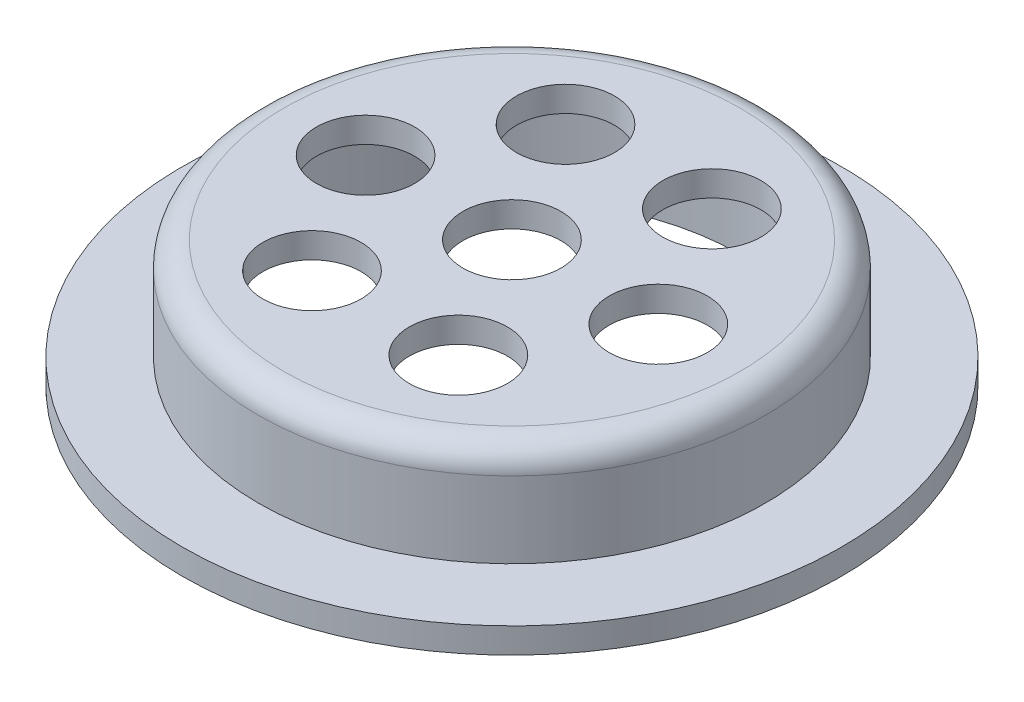
ISO-10303-21;
HEADER;
FILE_DESCRIPTION(('STEP AP214'),'2;1');
FILE_NAME('part.step','',(''),(''),'','','');
FILE_SCHEMA(('AUTOMOTIVE_DESIGN { 1 0 10303 214 1 1 1 1 }'));
ENDSEC;
DATA;
#1=APPLICATION_CONTEXT('core data for automotive mechanical design processes');
#2=APPLICATION_PROTOCOL_DEFINITION('international standard','automotive_design',2000,#1);
#3=PRODUCT_CONTEXT('',#1,'mechanical');
#4=PRODUCT('Part','Part','',(#3));
#5=PRODUCT_RELATED_PRODUCT_CATEGORY('part','',(#4));
#6=PRODUCT_DEFINITION_FORMATION('','',#4);
#7=PRODUCT_DEFINITION_CONTEXT('part definition',#1,'design');
#8=PRODUCT_DEFINITION('design','',#6,#7);
#9=PRODUCT_DEFINITION_SHAPE('','',#8);
#10=(LENGTH_UNIT() NAMED_UNIT(*) SI_UNIT(.MILLI.,.METRE.));
#11=(NAMED_UNIT(*) PLANE_ANGLE_UNIT() SI_UNIT($,.RADIAN.));
#12=(NAMED_UNIT(*) SI_UNIT($,.STERADIAN.) SOLID_ANGLE_UNIT());
#13=UNCERTAINTY_MEASURE_WITH_UNIT(LENGTH_MEASURE(1.E-05),#10,'distance_accuracy_value','');
#14=(GEOMETRIC_REPRESENTATION_CONTEXT(3) GLOBAL_UNCERTAINTY_ASSIGNED_CONTEXT((#13)) GLOBAL_UNIT_ASSIGNED_CONTEXT((#10,
#11,#12)) REPRESENTATION_CONTEXT('',''));
#15=CARTESIAN_POINT('',(0.,0.,0.));
#16=DIRECTION('',(0.,0.,1.));
#17=DIRECTION('',(1.,0.,0.));
#18=AXIS2_PLACEMENT_3D('',#15,#16,#17);
#19=CARTESIAN_POINT('',(0.,0.8,0.));
#20=DIRECTION('',(0.,-1.,0.));
#21=DIRECTION('',(0.,0.,-1.));
#22=AXIS2_PLACEMENT_3D('',#19,#20,#21);
#23=PLANE('',#22);
#24=CARTESIAN_POINT('',(-0.288675134594813,0.8,-0.5));
#25=DIRECTION('',(0.,1.,0.));
#26=DIRECTION('',(0.,0.,1.));
#27=AXIS2_PLACEMENT_3D('',#24,#25,#26);
#28=CIRCLE('',#27,0.193585201422163);
#29=CARTESIAN_POINT('',(-0.288675134594813,0.8,-0.306414798577837));
#30=VERTEX_POINT('',#29);
#31=EDGE_CURVE('E126',#30,#30,#28,.T.);
#32=ORIENTED_EDGE('',*,*,#31,.F.);
#33=EDGE_LOOP('',(#32));
#34=FACE_BOUND('',#33,.T.);
#35=CARTESIAN_POINT('',(0.288675134594813,0.8,-0.500000000000035));
#36=DIRECTION('',(0.,1.,0.));
#37=DIRECTION('',(0.,0.,1.));
#38=AXIS2_PLACEMENT_3D('',#35,#36,#37);
#39=CIRCLE('',#38,0.193585201422163);
#40=CARTESIAN_POINT('',(0.288675134594813,0.8,-0.306414798577872));
#41=VERTEX_POINT('',#40);
#42=EDGE_CURVE('E130',#41,#41,#39,.T.);
#43=ORIENTED_EDGE('',*,*,#42,.F.);
#44=EDGE_LOOP('',(#43));
#45=FACE_BOUND('',#44,.T.);
#46=CARTESIAN_POINT('',(0.577350269189656,0.8,0.));
#47=DIRECTION('',(0.,1.,0.));
#48=DIRECTION('',(0.,0.,1.));
#49=AXIS2_PLACEMENT_3D('',#46,#47,#48);
#50=CIRCLE('',#49,0.193585201422163);
#51=CARTESIAN_POINT('',(0.577350269189656,0.8,0.19358520142211));
#52=VERTEX_POINT('',#51);
#53=EDGE_CURVE('E134',#52,#52,#50,.T.);
#54=ORIENTED_EDGE('',*,*,#53,.F.);
#55=EDGE_LOOP('',(#54));
#56=FACE_BOUND('',#55,.T.);
#57=CARTESIAN_POINT('',(0.288675134594874,0.8,0.499999999999965));
#58=DIRECTION('',(0.,1.,0.));
#59=DIRECTION('',(0.,0.,1.));
#60=AXIS2_PLACEMENT_3D('',#57,#58,#59);
#61=CIRCLE('',#60,0.193585201422163);
#62=CARTESIAN_POINT('',(0.288675134594874,0.8,0.693585201422128));
#63=VERTEX_POINT('',#62);
#64=EDGE_CURVE('E138',#63,#63,#61,.T.);
#65=ORIENTED_EDGE('',*,*,#64,.F.);
#66=EDGE_LOOP('',(#65));
#67=FACE_BOUND('',#66,.T.);
#68=CARTESIAN_POINT('',(-0.288675134594752,0.8,0.5));
#69=DIRECTION('',(0.,1.,0.));
#70=DIRECTION('',(0.,0.,1.));
#71=AXIS2_PLACEMENT_3D('',#68,#69,#70);
#72=CIRCLE('',#71,0.193585201422163);
#73=CARTESIAN_POINT('',(-0.288675134594752,0.8,0.693585201422163));
#74=VERTEX_POINT('',#73);
#75=EDGE_CURVE('E142',#74,#74,#72,.T.);
#76=ORIENTED_EDGE('',*,*,#75,.F.);
#77=EDGE_LOOP('',(#76));
#78=FACE_BOUND('',#77,.T.);
#79=CARTESIAN_POINT('',(-0.577350269189596,0.8,0.));
#80=DIRECTION('',(0.,1.,0.));
#81=DIRECTION('',(0.,0.,1.));
#82=AXIS2_PLACEMENT_3D('',#79,#80,#81);
#83=CIRCLE('',#82,0.193585201422163);
#84=CARTESIAN_POINT('',(-0.577350269189596,0.8,0.193585201422181));
#85=VERTEX_POINT('',#84);
#86=EDGE_CURVE('E146',#85,#85,#83,.T.);
#87=ORIENTED_EDGE('',*,*,#86,.F.);
#88=EDGE_LOOP('',(#87));
#89=FACE_BOUND('',#88,.T.);
#90=CARTESIAN_POINT('',(0.,0.8,0.));
#91=DIRECTION('',(0.,1.,0.));
#92=DIRECTION('',(0.,0.,1.));
#93=AXIS2_PLACEMENT_3D('',#90,#91,#92);
#94=CIRCLE('',#93,0.193585201422163);
#95=CARTESIAN_POINT('',(0.,0.8,0.193585201422163));
#96=VERTEX_POINT('',#95);
#97=EDGE_CURVE('E52',#96,#96,#94,.T.);
#98=ORIENTED_EDGE('',*,*,#97,.F.);
#99=EDGE_LOOP('',(#98));
#100=FACE_BOUND('',#99,.T.);
#101=CARTESIAN_POINT('',(0.,0.8,0.));
#102=DIRECTION('',(0.,-1.,0.));
#103=DIRECTION('',(0.,0.,-1.));
#104=AXIS2_PLACEMENT_3D('',#101,#102,#103);
#105=CIRCLE('',#104,0.9);
#106=CARTESIAN_POINT('',(0.,0.8,-0.9));
#107=VERTEX_POINT('',#106);
#108=EDGE_CURVE('E39',#107,#107,#105,.F.);
#109=ORIENTED_EDGE('',*,*,#108,.T.);
#110=EDGE_LOOP('',(#109));
#111=FACE_BOUND('',#110,.T.);
#112=ADVANCED_FACE('F31',(#34,#45,#56,#67,#78,#89,#100,#111),#23,.F.);
#113=CARTESIAN_POINT('',(0.,2.36224489795918,0.));
#114=DIRECTION('',(0.,1.,0.));
#115=DIRECTION('',(0.,0.,1.));
#116=AXIS2_PLACEMENT_3D('',#113,#114,#115);
#117=CYLINDRICAL_SURFACE('',#116,1.);
#118=CARTESIAN_POINT('',(0.,0.7,0.));
#119=DIRECTION('',(0.,-1.,0.));
#120=DIRECTION('',(0.,0.,-1.));
#121=AXIS2_PLACEMENT_3D('',#118,#119,#120);
#122=CIRCLE('',#121,1.);
#123=CARTESIAN_POINT('',(0.,0.7,-1.));
#124=VERTEX_POINT('',#123);
#125=EDGE_CURVE('E10',#124,#124,#122,.T.);
#126=ORIENTED_EDGE('',*,*,#125,.T.);
#127=EDGE_LOOP('',(#126));
#128=FACE_BOUND('',#127,.T.);
#129=CARTESIAN_POINT('',(0.,0.4,0.));
#130=DIRECTION('',(0.,1.,0.));
#131=DIRECTION('',(0.,0.,1.));
#132=AXIS2_PLACEMENT_3D('',#129,#130,#131);
#133=CIRCLE('',#132,1.);
#134=CARTESIAN_POINT('',(0.,0.4,1.));
#135=VERTEX_POINT('',#134);
#136=EDGE_CURVE('E44',#135,#135,#133,.T.);
#137=ORIENTED_EDGE('',*,*,#136,.T.);
#138=EDGE_LOOP('',(#137));
#139=FACE_BOUND('',#138,.T.);
#140=ADVANCED_FACE('F89',(#128,#139),#117,.T.);
#141=CARTESIAN_POINT('',(1.,0.4,0.));
#142=DIRECTION('',(0.,-1.,0.));
#143=DIRECTION('',(0.,0.,-1.));
#144=AXIS2_PLACEMENT_3D('',#141,#142,#143);
#145=PLANE('',#144);
#146=ORIENTED_EDGE('',*,*,#136,.F.);
#147=EDGE_LOOP('',(#146));
#148=FACE_BOUND('',#147,.T.);
#149=CARTESIAN_POINT('',(0.,0.4,0.));
#150=DIRECTION('',(0.,1.,0.));
#151=DIRECTION('',(0.,0.,1.));
#152=AXIS2_PLACEMENT_3D('',#149,#150,#151);
#153=CIRCLE('',#152,1.3);
#154=CARTESIAN_POINT('',(0.,0.4,1.3));
#155=VERTEX_POINT('',#154);
#156=EDGE_CURVE('E84',#155,#155,#153,.T.);
#157=ORIENTED_EDGE('',*,*,#156,.T.);
#158=EDGE_LOOP('',(#157));
#159=FACE_BOUND('',#158,.T.);
#160=ADVANCED_FACE('F91',(#148,#159),#145,.F.);
#161=CARTESIAN_POINT('',(0.,2.36224489795918,0.));
#162=DIRECTION('',(0.,1.,0.));
#163=DIRECTION('',(0.,0.,1.));
#164=AXIS2_PLACEMENT_3D('',#161,#162,#163);
#165=CYLINDRICAL_SURFACE('',#164,1.3);
#166=ORIENTED_EDGE('',*,*,#156,.F.);
#167=EDGE_LOOP('',(#166));
#168=FACE_BOUND('',#167,.T.);
#169=CARTESIAN_POINT('',(0.,0.3,0.));
#170=DIRECTION('',(0.,1.,0.));
#171=DIRECTION('',(0.,0.,1.));
#172=AXIS2_PLACEMENT_3D('',#169,#170,#171);
#173=CIRCLE('',#172,1.3);
#174=CARTESIAN_POINT('',(0.,0.3,1.3));
#175=VERTEX_POINT('',#174);
#176=EDGE_CURVE('E77',#175,#175,#173,.T.);
#177=ORIENTED_EDGE('',*,*,#176,.T.);
#178=EDGE_LOOP('',(#177));
#179=FACE_BOUND('',#178,.T.);
#180=ADVANCED_FACE('F94',(#168,#179),#165,.T.);
#181=CARTESIAN_POINT('',(1.3,0.3,0.));
#182=DIRECTION('',(0.,1.,0.));
#183=DIRECTION('',(0.,0.,1.));
#184=AXIS2_PLACEMENT_3D('',#181,#182,#183);
#185=PLANE('',#184);
#186=ORIENTED_EDGE('',*,*,#176,.F.);
#187=EDGE_LOOP('',(#186));
#188=FACE_BOUND('',#187,.T.);
#189=CARTESIAN_POINT('',(0.,0.3,0.));
#190=DIRECTION('',(0.,1.,0.));
#191=DIRECTION('',(0.,0.,1.));
#192=AXIS2_PLACEMENT_3D('',#189,#190,#191);
#193=CIRCLE('',#192,0.9);
#194=CARTESIAN_POINT('',(0.,0.3,0.9));
#195=VERTEX_POINT('',#194);
#196=EDGE_CURVE('E72',#195,#195,#193,.T.);
#197=ORIENTED_EDGE('',*,*,#196,.T.);
#198=EDGE_LOOP('',(#197));
#199=FACE_BOUND('',#198,.T.);
#200=ADVANCED_FACE('F100',(#188,#199),#185,.F.);
#201=CARTESIAN_POINT('',(0.,2.36224489795918,0.));
#202=DIRECTION('',(0.,1.,0.));
#203=DIRECTION('',(0.,0.,1.));
#204=AXIS2_PLACEMENT_3D('',#201,#202,#203);
#205=CYLINDRICAL_SURFACE('',#204,0.9);
#206=ORIENTED_EDGE('',*,*,#196,.F.);
#207=EDGE_LOOP('',(#206));
#208=FACE_BOUND('',#207,.T.);
#209=CARTESIAN_POINT('',(0.,0.7,0.));
#210=DIRECTION('',(0.,1.,0.));
#211=DIRECTION('',(0.,0.,1.));
#212=AXIS2_PLACEMENT_3D('',#209,#210,#211);
#213=CIRCLE('',#212,0.9);
#214=CARTESIAN_POINT('',(0.,0.7,0.9));
#215=VERTEX_POINT('',#214);
#216=EDGE_CURVE('E68',#215,#215,#213,.T.);
#217=ORIENTED_EDGE('',*,*,#216,.T.);
#218=EDGE_LOOP('',(#217));
#219=FACE_BOUND('',#218,.T.);
#220=ADVANCED_FACE('F106',(#208,#219),#205,.F.);
#221=CARTESIAN_POINT('',(0.,0.7,0.));
#222=DIRECTION('',(0.,1.,0.));
#223=DIRECTION('',(0.,0.,1.));
#224=AXIS2_PLACEMENT_3D('',#221,#222,#223);
#225=PLANE('',#224);
#226=CARTESIAN_POINT('',(-0.288675134594813,0.7,-0.5));
#227=DIRECTION('',(0.,1.,0.));
#228=DIRECTION('',(0.,0.,1.));
#229=AXIS2_PLACEMENT_3D('',#226,#227,#228);
#230=CIRCLE('',#229,0.193585201422163);
#231=CARTESIAN_POINT('',(-0.288675134594813,0.7,-0.306414798577837));
#232=VERTEX_POINT('',#231);
#233=EDGE_CURVE('E35',#232,#232,#230,.T.);
#234=ORIENTED_EDGE('',*,*,#233,.T.);
#235=EDGE_LOOP('',(#234));
#236=FACE_BOUND('',#235,.T.);
#237=CARTESIAN_POINT('',(0.288675134594813,0.7,-0.500000000000035));
#238=DIRECTION('',(0.,1.,0.));
#239=DIRECTION('',(0.,0.,1.));
#240=AXIS2_PLACEMENT_3D('',#237,#238,#239);
#241=CIRCLE('',#240,0.193585201422163);
#242=CARTESIAN_POINT('',(0.288675134594813,0.7,-0.306414798577872));
#243=VERTEX_POINT('',#242);
#244=EDGE_CURVE('E63',#243,#243,#241,.T.);
#245=ORIENTED_EDGE('',*,*,#244,.T.);
#246=EDGE_LOOP('',(#245));
#247=FACE_BOUND('',#246,.T.);
#248=CARTESIAN_POINT('',(0.577350269189656,0.7,0.));
#249=DIRECTION('',(0.,1.,0.));
#250=DIRECTION('',(0.,0.,1.));
#251=AXIS2_PLACEMENT_3D('',#248,#249,#250);
#252=CIRCLE('',#251,0.193585201422163);
#253=CARTESIAN_POINT('',(0.577350269189656,0.7,0.19358520142211));
#254=VERTEX_POINT('',#253);
#255=EDGE_CURVE('E61',#254,#254,#252,.T.);
#256=ORIENTED_EDGE('',*,*,#255,.T.);
#257=EDGE_LOOP('',(#256));
#258=FACE_BOUND('',#257,.T.);
#259=CARTESIAN_POINT('',(0.288675134594874,0.7,0.499999999999965));
#260=DIRECTION('',(0.,1.,0.));
#261=DIRECTION('',(0.,0.,1.));
#262=AXIS2_PLACEMENT_3D('',#259,#260,#261);
#263=CIRCLE('',#262,0.193585201422163);
#264=CARTESIAN_POINT('',(0.288675134594874,0.7,0.693585201422128));
#265=VERTEX_POINT('',#264);
#266=EDGE_CURVE('E58',#265,#265,#263,.T.);
#267=ORIENTED_EDGE('',*,*,#266,.T.);
#268=EDGE_LOOP('',(#267));
#269=FACE_BOUND('',#268,.T.);
#270=CARTESIAN_POINT('',(-0.288675134594752,0.7,0.5));
#271=DIRECTION('',(0.,1.,0.));
#272=DIRECTION('',(0.,0.,1.));
#273=AXIS2_PLACEMENT_3D('',#270,#271,#272);
#274=CIRCLE('',#273,0.193585201422163);
#275=CARTESIAN_POINT('',(-0.288675134594752,0.7,0.693585201422163));
#276=VERTEX_POINT('',#275);
#277=EDGE_CURVE('E55',#276,#276,#274,.T.);
#278=ORIENTED_EDGE('',*,*,#277,.T.);
#279=EDGE_LOOP('',(#278));
#280=FACE_BOUND('',#279,.T.);
#281=CARTESIAN_POINT('',(-0.577350269189596,0.7,0.));
#282=DIRECTION('',(0.,1.,0.));
#283=DIRECTION('',(0.,0.,1.));
#284=AXIS2_PLACEMENT_3D('',#281,#282,#283);
#285=CIRCLE('',#284,0.193585201422163);
#286=CARTESIAN_POINT('',(-0.577350269189596,0.7,0.193585201422181));
#287=VERTEX_POINT('',#286);
#288=EDGE_CURVE('E51',#287,#287,#285,.T.);
#289=ORIENTED_EDGE('',*,*,#288,.T.);
#290=EDGE_LOOP('',(#289));
#291=FACE_BOUND('',#290,.T.);
#292=CARTESIAN_POINT('',(0.,0.7,0.));
#293=DIRECTION('',(0.,1.,0.));
#294=DIRECTION('',(0.,0.,1.));
#295=AXIS2_PLACEMENT_3D('',#292,#293,#294);
#296=CIRCLE('',#295,0.193585201422163);
#297=CARTESIAN_POINT('',(0.,0.7,0.193585201422163));
#298=VERTEX_POINT('',#297);
#299=EDGE_CURVE('E48',#298,#298,#296,.T.);
#300=ORIENTED_EDGE('',*,*,#299,.T.);
#301=EDGE_LOOP('',(#300));
#302=FACE_BOUND('',#301,.T.);
#303=ORIENTED_EDGE('',*,*,#216,.F.);
#304=EDGE_LOOP('',(#303));
#305=FACE_BOUND('',#304,.T.);
#306=ADVANCED_FACE('F111',(#236,#247,#258,#269,#280,#291,#302,#305),#225,.F.);
#307=CARTESIAN_POINT('',(0.,0.7,0.));
#308=DIRECTION('',(0.,-1.,0.));
#309=DIRECTION('',(0.,0.,-1.));
#310=AXIS2_PLACEMENT_3D('',#307,#308,#309);
#311=TOROIDAL_SURFACE('',#310,0.9,0.1);
#312=ORIENTED_EDGE('',*,*,#125,.F.);
#313=EDGE_LOOP('',(#312));
#314=FACE_BOUND('',#313,.T.);
#315=ORIENTED_EDGE('',*,*,#108,.F.);
#316=EDGE_LOOP('',(#315));
#317=FACE_BOUND('',#316,.T.);
#318=ADVANCED_FACE('F33',(#314,#317),#311,.T.);
#319=CARTESIAN_POINT('',(0.,0.3,0.));
#320=DIRECTION('',(0.,1.,0.));
#321=DIRECTION('',(0.,0.,1.));
#322=AXIS2_PLACEMENT_3D('',#319,#320,#321);
#323=CYLINDRICAL_SURFACE('',#322,0.193585201422163);
#324=ORIENTED_EDGE('',*,*,#97,.T.);
#325=EDGE_LOOP('',(#324));
#326=FACE_BOUND('',#325,.T.);
#327=ORIENTED_EDGE('',*,*,#299,.F.);
#328=EDGE_LOOP('',(#327));
#329=FACE_BOUND('',#328,.T.);
#330=ADVANCED_FACE('F153',(#326,#329),#323,.F.);
#331=CARTESIAN_POINT('',(-0.577350269189596,0.3,0.));
#332=DIRECTION('',(0.,1.,0.));
#333=DIRECTION('',(0.,0.,1.));
#334=AXIS2_PLACEMENT_3D('',#331,#332,#333);
#335=CYLINDRICAL_SURFACE('',#334,0.193585201422163);
#336=ORIENTED_EDGE('',*,*,#86,.T.);
#337=EDGE_LOOP('',(#336));
#338=FACE_BOUND('',#337,.T.);
#339=ORIENTED_EDGE('',*,*,#288,.F.);
#340=EDGE_LOOP('',(#339));
#341=FACE_BOUND('',#340,.T.);
#342=ADVANCED_FACE('F158',(#338,#341),#335,.F.);
#343=CARTESIAN_POINT('',(-0.288675134594752,0.3,0.5));
#344=DIRECTION('',(0.,1.,0.));
#345=DIRECTION('',(0.,0.,1.));
#346=AXIS2_PLACEMENT_3D('',#343,#344,#345);
#347=CYLINDRICAL_SURFACE('',#346,0.193585201422163);
#348=ORIENTED_EDGE('',*,*,#75,.T.);
#349=EDGE_LOOP('',(#348));
#350=FACE_BOUND('',#349,.T.);
#351=ORIENTED_EDGE('',*,*,#277,.F.);
#352=EDGE_LOOP('',(#351));
#353=FACE_BOUND('',#352,.T.);
#354=ADVANCED_FACE('F164',(#350,#353),#347,.F.);
#355=CARTESIAN_POINT('',(0.288675134594874,0.3,0.499999999999965));
#356=DIRECTION('',(0.,1.,0.));
#357=DIRECTION('',(0.,0.,1.));
#358=AXIS2_PLACEMENT_3D('',#355,#356,#357);
#359=CYLINDRICAL_SURFACE('',#358,0.193585201422163);
#360=ORIENTED_EDGE('',*,*,#64,.T.);
#361=EDGE_LOOP('',(#360));
#362=FACE_BOUND('',#361,.T.);
#363=ORIENTED_EDGE('',*,*,#266,.F.);
#364=EDGE_LOOP('',(#363));
#365=FACE_BOUND('',#364,.T.);
#366=ADVANCED_FACE('F169',(#362,#365),#359,.F.);
#367=CARTESIAN_POINT('',(0.577350269189656,0.3,0.));
#368=DIRECTION('',(0.,1.,0.));
#369=DIRECTION('',(0.,0.,1.));
#370=AXIS2_PLACEMENT_3D('',#367,#368,#369);
#371=CYLINDRICAL_SURFACE('',#370,0.193585201422163);
#372=ORIENTED_EDGE('',*,*,#53,.T.);
#373=EDGE_LOOP('',(#372));
#374=FACE_BOUND('',#373,.T.);
#375=ORIENTED_EDGE('',*,*,#255,.F.);
#376=EDGE_LOOP('',(#375));
#377=FACE_BOUND('',#376,.T.);
#378=ADVANCED_FACE('F172',(#374,#377),#371,.F.);
#379=CARTESIAN_POINT('',(0.288675134594813,0.3,-0.500000000000035));
#380=DIRECTION('',(0.,1.,0.));
#381=DIRECTION('',(0.,0.,1.));
#382=AXIS2_PLACEMENT_3D('',#379,#380,#381);
#383=CYLINDRICAL_SURFACE('',#382,0.193585201422163);
#384=ORIENTED_EDGE('',*,*,#42,.T.);
#385=EDGE_LOOP('',(#384));
#386=FACE_BOUND('',#385,.T.);
#387=ORIENTED_EDGE('',*,*,#244,.F.);
#388=EDGE_LOOP('',(#387));
#389=FACE_BOUND('',#388,.T.);
#390=ADVANCED_FACE('F176',(#386,#389),#383,.F.);
#391=CARTESIAN_POINT('',(-0.288675134594813,0.3,-0.5));
#392=DIRECTION('',(0.,1.,0.));
#393=DIRECTION('',(0.,0.,1.));
#394=AXIS2_PLACEMENT_3D('',#391,#392,#393);
#395=CYLINDRICAL_SURFACE('',#394,0.193585201422163);
#396=ORIENTED_EDGE('',*,*,#31,.T.);
#397=EDGE_LOOP('',(#396));
#398=FACE_BOUND('',#397,.T.);
#399=ORIENTED_EDGE('',*,*,#233,.F.);
#400=EDGE_LOOP('',(#399));
#401=FACE_BOUND('',#400,.T.);
#402=ADVANCED_FACE('F180',(#398,#401),#395,.F.);
#403=CLOSED_SHELL('',(#112,#140,#160,#180,#200,#220,#306,#318,#330,#342,#354,#366,#378,#390,#402));
#404=MANIFOLD_SOLID_BREP('B2',#403);
#405=ADVANCED_BREP_SHAPE_REPRESENTATION('',(#18,#404),#14);
#406=SHAPE_DEFINITION_REPRESENTATION(#9,#405);
ENDSEC;
END-ISO-10303-21;
